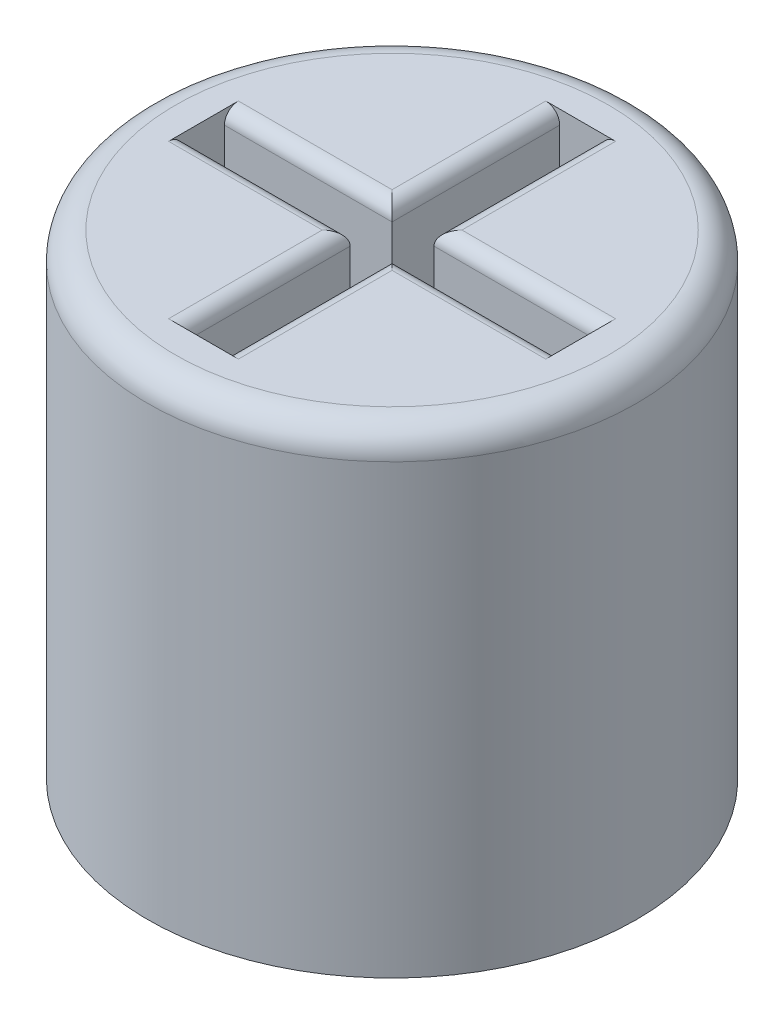
ISO-10303-21;
HEADER;
FILE_DESCRIPTION(('STEP AP214'),'2;1');
FILE_NAME('part.step','',(''),(''),'','','');
FILE_SCHEMA(('AUTOMOTIVE_DESIGN { 1 0 10303 214 1 1 1 1 }'));
ENDSEC;
DATA;
#1=APPLICATION_CONTEXT('core data for automotive mechanical design processes');
#2=APPLICATION_PROTOCOL_DEFINITION('international standard','automotive_design',2000,#1);
#3=PRODUCT_CONTEXT('',#1,'mechanical');
#4=PRODUCT('Part','Part','',(#3));
#5=PRODUCT_RELATED_PRODUCT_CATEGORY('part','',(#4));
#6=PRODUCT_DEFINITION_FORMATION('','',#4);
#7=PRODUCT_DEFINITION_CONTEXT('part definition',#1,'design');
#8=PRODUCT_DEFINITION('design','',#6,#7);
#9=PRODUCT_DEFINITION_SHAPE('','',#8);
#10=(LENGTH_UNIT() NAMED_UNIT(*) SI_UNIT(.MILLI.,.METRE.));
#11=(NAMED_UNIT(*) PLANE_ANGLE_UNIT() SI_UNIT($,.RADIAN.));
#12=(NAMED_UNIT(*) SI_UNIT($,.STERADIAN.) SOLID_ANGLE_UNIT());
#13=UNCERTAINTY_MEASURE_WITH_UNIT(LENGTH_MEASURE(1.E-05),#10,'distance_accuracy_value','');
#14=(GEOMETRIC_REPRESENTATION_CONTEXT(3) GLOBAL_UNCERTAINTY_ASSIGNED_CONTEXT((#13)) GLOBAL_UNIT_ASSIGNED_CONTEXT((#10,
#11,#12)) REPRESENTATION_CONTEXT('',''));
#15=CARTESIAN_POINT('',(0.,0.,0.));
#16=DIRECTION('',(0.,0.,1.));
#17=DIRECTION('',(1.,0.,0.));
#18=AXIS2_PLACEMENT_3D('',#15,#16,#17);
#19=CARTESIAN_POINT('',(-2.575,9.700000149012,-0.250000044703));
#20=DIRECTION('',(-1.,0.,0.));
#21=DIRECTION('',(0.,0.707106781186548,-0.707106781186548));
#22=AXIS2_PLACEMENT_3D('',#19,#20,#21);
#23=CYLINDRICAL_SURFACE('',#22,0.1);
#24=DIRECTION('',(-1.,0.,0.));
#25=VECTOR('',#24,1.);
#26=CARTESIAN_POINT('',(-2.575,9.700000149012,-0.350000044703));
#27=LINE('',#26,#25);
#28=CARTESIAN_POINT('',(-2.65,9.700000149012,-0.350000044703));
#29=VERTEX_POINT('',#28);
#30=CARTESIAN_POINT('',(-3.85,9.700000149012,-0.350000044703));
#31=VERTEX_POINT('',#30);
#32=EDGE_CURVE('E11',#29,#31,#27,.T.);
#33=ORIENTED_EDGE('',*,*,#32,.T.);
#34=CARTESIAN_POINT('',(-3.85,9.700000149012,-0.250000044703));
#35=DIRECTION('',(-1.,0.,0.));
#36=DIRECTION('',(0.,0.707106781186548,-0.707106781186548));
#37=AXIS2_PLACEMENT_3D('',#34,#35,#36);
#38=CIRCLE('',#37,0.1);
#39=CARTESIAN_POINT('',(-3.85,9.800000149012,-0.250000044703));
#40=VERTEX_POINT('',#39);
#41=EDGE_CURVE('E24',#40,#31,#38,.T.);
#42=ORIENTED_EDGE('',*,*,#41,.F.);
#43=DIRECTION('',(1.,0.,0.));
#44=VECTOR('',#43,1.);
#45=CARTESIAN_POINT('',(-2.575,9.800000149012,-0.250000044703));
#46=LINE('',#45,#44);
#47=CARTESIAN_POINT('',(-2.75,9.800000149012,-0.250000044703));
#48=VERTEX_POINT('',#47);
#49=EDGE_CURVE('E317',#40,#48,#46,.T.);
#50=ORIENTED_EDGE('',*,*,#49,.T.);
#51=CARTESIAN_POINT('',(-2.75,9.700000149012,-0.250000044703));
#52=DIRECTION('',(-0.707106781186548,0.,-0.707106781186548));
#53=DIRECTION('',(0.707106781186548,0.,-0.707106781186548));
#54=AXIS2_PLACEMENT_3D('',#51,#52,#53);
#55=ELLIPSE('',#54,0.141421356237,0.1);
#56=EDGE_CURVE('E315',#48,#29,#55,.T.);
#57=ORIENTED_EDGE('',*,*,#56,.T.);
#58=EDGE_LOOP('',(#33,#42,#50,#57));
#59=FACE_BOUND('',#58,.T.);
#60=ADVANCED_FACE('F17',(#59),#23,.T.);
#61=CARTESIAN_POINT('',(-2.75,9.700000149012,0.174999955297));
#62=DIRECTION('',(0.,0.,-1.));
#63=DIRECTION('',(0.707106781186548,0.707106781186548,0.));
#64=AXIS2_PLACEMENT_3D('',#61,#62,#63);
#65=CYLINDRICAL_SURFACE('',#64,0.1);
#66=DIRECTION('',(0.,0.,1.));
#67=VECTOR('',#66,1.);
#68=CARTESIAN_POINT('',(-2.75,9.800000149012,0.174999955297));
#69=LINE('',#68,#67);
#70=CARTESIAN_POINT('',(-2.75,9.800000149012,0.849999955297));
#71=VERTEX_POINT('',#70);
#72=EDGE_CURVE('E313',#48,#71,#69,.T.);
#73=ORIENTED_EDGE('',*,*,#72,.T.);
#74=CARTESIAN_POINT('',(-2.75,9.700000149012,0.849999955297));
#75=DIRECTION('',(0.,0.,1.));
#76=DIRECTION('',(0.707106781186548,0.707106781186548,0.));
#77=AXIS2_PLACEMENT_3D('',#74,#75,#76);
#78=CIRCLE('',#77,0.1);
#79=CARTESIAN_POINT('',(-2.65,9.700000149012,0.849999955297));
#80=VERTEX_POINT('',#79);
#81=EDGE_CURVE('E310',#80,#71,#78,.T.);
#82=ORIENTED_EDGE('',*,*,#81,.F.);
#83=DIRECTION('',(0.,0.,-1.));
#84=VECTOR('',#83,1.);
#85=CARTESIAN_POINT('',(-2.65,9.700000149012,0.174999955297));
#86=LINE('',#85,#84);
#87=EDGE_CURVE('E307',#80,#29,#86,.T.);
#88=ORIENTED_EDGE('',*,*,#87,.T.);
#89=ORIENTED_EDGE('',*,*,#56,.F.);
#90=EDGE_LOOP('',(#73,#82,#88,#89));
#91=FACE_BOUND('',#90,.T.);
#92=ADVANCED_FACE('F343',(#91),#65,.T.);
#93=CARTESIAN_POINT('',(-2.65,9.800000149012,-0.350000044703));
#94=DIRECTION('',(0.,0.,1.));
#95=DIRECTION('',(-1.,0.,0.));
#96=AXIS2_PLACEMENT_3D('',#93,#94,#95);
#97=PLANE('',#96);
#98=ORIENTED_EDGE('',*,*,#32,.F.);
#99=DIRECTION('',(0.,-1.,0.));
#100=VECTOR('',#99,1.);
#101=CARTESIAN_POINT('',(-2.65,9.800000149012,-0.350000044703));
#102=LINE('',#101,#100);
#103=CARTESIAN_POINT('',(-2.65,9.000000149012,-0.350000044703));
#104=VERTEX_POINT('',#103);
#105=EDGE_CURVE('E305',#29,#104,#102,.T.);
#106=ORIENTED_EDGE('',*,*,#105,.T.);
#107=DIRECTION('',(-1.,0.,0.));
#108=VECTOR('',#107,1.);
#109=CARTESIAN_POINT('',(-2.65,9.000000149012,-0.350000044703));
#110=LINE('',#109,#108);
#111=CARTESIAN_POINT('',(-3.85,9.000000149012,-0.350000044703));
#112=VERTEX_POINT('',#111);
#113=EDGE_CURVE('E302',#104,#112,#110,.T.);
#114=ORIENTED_EDGE('',*,*,#113,.T.);
#115=DIRECTION('',(0.,-1.,0.));
#116=VECTOR('',#115,1.);
#117=CARTESIAN_POINT('',(-3.85,9.800000149012,-0.350000044703));
#118=LINE('',#117,#116);
#119=EDGE_CURVE('E300',#31,#112,#118,.T.);
#120=ORIENTED_EDGE('',*,*,#119,.F.);
#121=EDGE_LOOP('',(#98,#106,#114,#120));
#122=FACE_BOUND('',#121,.T.);
#123=ADVANCED_FACE('F322',(#122),#97,.F.);
#124=CARTESIAN_POINT('',(-2.65,9.800000149012,0.849999955297));
#125=DIRECTION('',(-1.,0.,0.));
#126=DIRECTION('',(0.,0.,-1.));
#127=AXIS2_PLACEMENT_3D('',#124,#125,#126);
#128=PLANE('',#127);
#129=ORIENTED_EDGE('',*,*,#87,.F.);
#130=DIRECTION('',(0.,-1.,0.));
#131=VECTOR('',#130,1.);
#132=CARTESIAN_POINT('',(-2.65,9.800000149012,0.849999955297));
#133=LINE('',#132,#131);
#134=CARTESIAN_POINT('',(-2.65,9.000000149012,0.849999955297));
#135=VERTEX_POINT('',#134);
#136=EDGE_CURVE('E297',#80,#135,#133,.T.);
#137=ORIENTED_EDGE('',*,*,#136,.T.);
#138=DIRECTION('',(0.,0.,-1.));
#139=VECTOR('',#138,1.);
#140=CARTESIAN_POINT('',(-2.65,9.000000149012,0.849999955297));
#141=LINE('',#140,#139);
#142=EDGE_CURVE('E294',#135,#104,#141,.T.);
#143=ORIENTED_EDGE('',*,*,#142,.T.);
#144=ORIENTED_EDGE('',*,*,#105,.F.);
#145=EDGE_LOOP('',(#129,#137,#143,#144));
#146=FACE_BOUND('',#145,.T.);
#147=ADVANCED_FACE('F347',(#146),#128,.F.);
#148=CARTESIAN_POINT('',(-2.25,9.700000149012,-0.425000044703));
#149=DIRECTION('',(0.,0.,1.));
#150=DIRECTION('',(-0.707106781186548,0.707106781186548,0.));
#151=AXIS2_PLACEMENT_3D('',#148,#149,#150);
#152=CYLINDRICAL_SURFACE('',#151,0.1);
#153=DIRECTION('',(0.,0.,1.));
#154=VECTOR('',#153,1.);
#155=CARTESIAN_POINT('',(-2.35,9.700000149012,-0.425000044703));
#156=LINE('',#155,#154);
#157=CARTESIAN_POINT('',(-2.35,9.700000149012,-0.350000044703));
#158=VERTEX_POINT('',#157);
#159=CARTESIAN_POINT('',(-2.35,9.700000149012,0.849999955297));
#160=VERTEX_POINT('',#159);
#161=EDGE_CURVE('E292',#158,#160,#156,.T.);
#162=ORIENTED_EDGE('',*,*,#161,.T.);
#163=CARTESIAN_POINT('',(-2.25,9.700000149012,0.849999955297));
#164=DIRECTION('',(0.,0.,1.));
#165=DIRECTION('',(-0.707106781186548,0.707106781186548,0.));
#166=AXIS2_PLACEMENT_3D('',#163,#164,#165);
#167=CIRCLE('',#166,0.1);
#168=CARTESIAN_POINT('',(-2.25,9.800000149012,0.849999955297));
#169=VERTEX_POINT('',#168);
#170=EDGE_CURVE('E289',#169,#160,#167,.T.);
#171=ORIENTED_EDGE('',*,*,#170,.F.);
#172=DIRECTION('',(0.,0.,-1.));
#173=VECTOR('',#172,1.);
#174=CARTESIAN_POINT('',(-2.25,9.800000149012,-0.425000044703));
#175=LINE('',#174,#173);
#176=CARTESIAN_POINT('',(-2.25,9.800000149012,-0.250000044703));
#177=VERTEX_POINT('',#176);
#178=EDGE_CURVE('E287',#169,#177,#175,.T.);
#179=ORIENTED_EDGE('',*,*,#178,.T.);
#180=CARTESIAN_POINT('',(-2.25,9.700000149012,-0.250000044703));
#181=DIRECTION('',(-0.707106781186548,0.,0.707106781186548));
#182=DIRECTION('',(-0.707106781186548,0.,-0.707106781186548));
#183=AXIS2_PLACEMENT_3D('',#180,#181,#182);
#184=ELLIPSE('',#183,0.141421356237,0.1);
#185=EDGE_CURVE('E284',#177,#158,#184,.T.);
#186=ORIENTED_EDGE('',*,*,#185,.T.);
#187=EDGE_LOOP('',(#162,#171,#179,#186));
#188=FACE_BOUND('',#187,.T.);
#189=ADVANCED_FACE('F400',(#188),#152,.T.);
#190=CARTESIAN_POINT('',(-1.825,9.700000149012,-0.250000044703));
#191=DIRECTION('',(-1.,0.,0.));
#192=DIRECTION('',(0.,0.707106781186548,-0.707106781186548));
#193=AXIS2_PLACEMENT_3D('',#190,#191,#192);
#194=CYLINDRICAL_SURFACE('',#193,0.1);
#195=DIRECTION('',(1.,0.,0.));
#196=VECTOR('',#195,1.);
#197=CARTESIAN_POINT('',(-1.825,9.800000149012,-0.250000044703));
#198=LINE('',#197,#196);
#199=CARTESIAN_POINT('',(-1.15,9.800000149012,-0.250000044703));
#200=VERTEX_POINT('',#199);
#201=EDGE_CURVE('E282',#177,#200,#198,.T.);
#202=ORIENTED_EDGE('',*,*,#201,.T.);
#203=CARTESIAN_POINT('',(-1.15,9.700000149012,-0.250000044703));
#204=DIRECTION('',(1.,0.,0.));
#205=DIRECTION('',(0.,0.707106781186548,-0.707106781186548));
#206=AXIS2_PLACEMENT_3D('',#203,#204,#205);
#207=CIRCLE('',#206,0.1);
#208=CARTESIAN_POINT('',(-1.15,9.700000149012,-0.350000044703));
#209=VERTEX_POINT('',#208);
#210=EDGE_CURVE('E279',#209,#200,#207,.T.);
#211=ORIENTED_EDGE('',*,*,#210,.F.);
#212=DIRECTION('',(-1.,0.,0.));
#213=VECTOR('',#212,1.);
#214=CARTESIAN_POINT('',(-1.825,9.700000149012,-0.350000044703));
#215=LINE('',#214,#213);
#216=EDGE_CURVE('E276',#209,#158,#215,.T.);
#217=ORIENTED_EDGE('',*,*,#216,.T.);
#218=ORIENTED_EDGE('',*,*,#185,.F.);
#219=EDGE_LOOP('',(#202,#211,#217,#218));
#220=FACE_BOUND('',#219,.T.);
#221=ADVANCED_FACE('F403',(#220),#194,.T.);
#222=CARTESIAN_POINT('',(-2.35,9.800000149012,-0.350000044703));
#223=DIRECTION('',(1.,0.,0.));
#224=DIRECTION('',(0.,0.,1.));
#225=AXIS2_PLACEMENT_3D('',#222,#223,#224);
#226=PLANE('',#225);
#227=ORIENTED_EDGE('',*,*,#161,.F.);
#228=DIRECTION('',(0.,-1.,0.));
#229=VECTOR('',#228,1.);
#230=CARTESIAN_POINT('',(-2.35,9.800000149012,-0.350000044703));
#231=LINE('',#230,#229);
#232=CARTESIAN_POINT('',(-2.35,9.000000149012,-0.350000044703));
#233=VERTEX_POINT('',#232);
#234=EDGE_CURVE('E273',#158,#233,#231,.T.);
#235=ORIENTED_EDGE('',*,*,#234,.T.);
#236=DIRECTION('',(0.,0.,1.));
#237=VECTOR('',#236,1.);
#238=CARTESIAN_POINT('',(-2.35,9.000000149012,-0.350000044703));
#239=LINE('',#238,#237);
#240=CARTESIAN_POINT('',(-2.35,9.000000149012,0.849999955297));
#241=VERTEX_POINT('',#240);
#242=EDGE_CURVE('E270',#233,#241,#239,.T.);
#243=ORIENTED_EDGE('',*,*,#242,.T.);
#244=DIRECTION('',(0.,-1.,0.));
#245=VECTOR('',#244,1.);
#246=CARTESIAN_POINT('',(-2.35,9.800000149012,0.849999955297));
#247=LINE('',#246,#245);
#248=EDGE_CURVE('E268',#160,#241,#247,.T.);
#249=ORIENTED_EDGE('',*,*,#248,.F.);
#250=EDGE_LOOP('',(#227,#235,#243,#249));
#251=FACE_BOUND('',#250,.T.);
#252=ADVANCED_FACE('F354',(#251),#226,.F.);
#253=CARTESIAN_POINT('',(-1.15,9.800000149012,-0.350000044703));
#254=DIRECTION('',(0.,0.,1.));
#255=DIRECTION('',(-1.,0.,0.));
#256=AXIS2_PLACEMENT_3D('',#253,#254,#255);
#257=PLANE('',#256);
#258=ORIENTED_EDGE('',*,*,#216,.F.);
#259=DIRECTION('',(0.,-1.,0.));
#260=VECTOR('',#259,1.);
#261=CARTESIAN_POINT('',(-1.15,9.800000149012,-0.350000044703));
#262=LINE('',#261,#260);
#263=CARTESIAN_POINT('',(-1.15,9.000000149012,-0.350000044703));
#264=VERTEX_POINT('',#263);
#265=EDGE_CURVE('E265',#209,#264,#262,.T.);
#266=ORIENTED_EDGE('',*,*,#265,.T.);
#267=DIRECTION('',(-1.,0.,0.));
#268=VECTOR('',#267,1.);
#269=CARTESIAN_POINT('',(-1.15,9.000000149012,-0.350000044703));
#270=LINE('',#269,#268);
#271=EDGE_CURVE('E262',#264,#233,#270,.T.);
#272=ORIENTED_EDGE('',*,*,#271,.T.);
#273=ORIENTED_EDGE('',*,*,#234,.F.);
#274=EDGE_LOOP('',(#258,#266,#272,#273));
#275=FACE_BOUND('',#274,.T.);
#276=ADVANCED_FACE('F358',(#275),#257,.F.);
#277=CARTESIAN_POINT('',(-2.425,9.700000149012,-0.750000044703));
#278=DIRECTION('',(1.,0.,0.));
#279=DIRECTION('',(0.,0.707106781186548,0.707106781186548));
#280=AXIS2_PLACEMENT_3D('',#277,#278,#279);
#281=CYLINDRICAL_SURFACE('',#280,0.1);
#282=DIRECTION('',(1.,0.,0.));
#283=VECTOR('',#282,1.);
#284=CARTESIAN_POINT('',(-2.425,9.700000149012,-0.650000044703));
#285=LINE('',#284,#283);
#286=CARTESIAN_POINT('',(-2.35,9.700000149012,-0.650000044703));
#287=VERTEX_POINT('',#286);
#288=CARTESIAN_POINT('',(-1.15,9.700000149012,-0.650000044703));
#289=VERTEX_POINT('',#288);
#290=EDGE_CURVE('E260',#287,#289,#285,.T.);
#291=ORIENTED_EDGE('',*,*,#290,.T.);
#292=CARTESIAN_POINT('',(-1.15,9.700000149012,-0.750000044703));
#293=DIRECTION('',(1.,0.,0.));
#294=DIRECTION('',(0.,0.707106781186548,0.707106781186548));
#295=AXIS2_PLACEMENT_3D('',#292,#293,#294);
#296=CIRCLE('',#295,0.1);
#297=CARTESIAN_POINT('',(-1.15,9.800000149012,-0.750000044703));
#298=VERTEX_POINT('',#297);
#299=EDGE_CURVE('E257',#298,#289,#296,.T.);
#300=ORIENTED_EDGE('',*,*,#299,.F.);
#301=DIRECTION('',(-1.,0.,0.));
#302=VECTOR('',#301,1.);
#303=CARTESIAN_POINT('',(-2.425,9.800000149012,-0.750000044703));
#304=LINE('',#303,#302);
#305=CARTESIAN_POINT('',(-2.25,9.800000149012,-0.750000044703));
#306=VERTEX_POINT('',#305);
#307=EDGE_CURVE('E255',#298,#306,#304,.T.);
#308=ORIENTED_EDGE('',*,*,#307,.T.);
#309=CARTESIAN_POINT('',(-2.25,9.700000149012,-0.750000044703));
#310=DIRECTION('',(0.707106781186548,0.,0.707106781186548));
#311=DIRECTION('',(-0.707106781186548,0.,0.707106781186548));
#312=AXIS2_PLACEMENT_3D('',#309,#310,#311);
#313=ELLIPSE('',#312,0.141421356237,0.1);
#314=EDGE_CURVE('E252',#306,#287,#313,.T.);
#315=ORIENTED_EDGE('',*,*,#314,.T.);
#316=EDGE_LOOP('',(#291,#300,#308,#315));
#317=FACE_BOUND('',#316,.T.);
#318=ADVANCED_FACE('F412',(#317),#281,.T.);
#319=CARTESIAN_POINT('',(-2.25,9.700000149012,-1.175000044703));
#320=DIRECTION('',(0.,0.,1.));
#321=DIRECTION('',(-0.707106781186548,0.707106781186548,0.));
#322=AXIS2_PLACEMENT_3D('',#319,#320,#321);
#323=CYLINDRICAL_SURFACE('',#322,0.1);
#324=DIRECTION('',(0.,0.,-1.));
#325=VECTOR('',#324,1.);
#326=CARTESIAN_POINT('',(-2.25,9.800000149012,-1.175000044703));
#327=LINE('',#326,#325);
#328=CARTESIAN_POINT('',(-2.25,9.800000149012,-1.850000044703));
#329=VERTEX_POINT('',#328);
#330=EDGE_CURVE('E250',#306,#329,#327,.T.);
#331=ORIENTED_EDGE('',*,*,#330,.T.);
#332=CARTESIAN_POINT('',(-2.25,9.700000149012,-1.850000044703));
#333=DIRECTION('',(0.,0.,-1.));
#334=DIRECTION('',(-0.707106781186548,0.707106781186548,0.));
#335=AXIS2_PLACEMENT_3D('',#332,#333,#334);
#336=CIRCLE('',#335,0.1);
#337=CARTESIAN_POINT('',(-2.35,9.700000149012,-1.850000044703));
#338=VERTEX_POINT('',#337);
#339=EDGE_CURVE('E247',#338,#329,#336,.T.);
#340=ORIENTED_EDGE('',*,*,#339,.F.);
#341=DIRECTION('',(0.,0.,1.));
#342=VECTOR('',#341,1.);
#343=CARTESIAN_POINT('',(-2.35,9.700000149012,-1.175000044703));
#344=LINE('',#343,#342);
#345=EDGE_CURVE('E244',#338,#287,#344,.T.);
#346=ORIENTED_EDGE('',*,*,#345,.T.);
#347=ORIENTED_EDGE('',*,*,#314,.F.);
#348=EDGE_LOOP('',(#331,#340,#346,#347));
#349=FACE_BOUND('',#348,.T.);
#350=ADVANCED_FACE('F415',(#349),#323,.T.);
#351=CARTESIAN_POINT('',(-2.35,9.800000149012,-0.650000044703));
#352=DIRECTION('',(0.,0.,-1.));
#353=DIRECTION('',(1.,0.,0.));
#354=AXIS2_PLACEMENT_3D('',#351,#352,#353);
#355=PLANE('',#354);
#356=ORIENTED_EDGE('',*,*,#290,.F.);
#357=DIRECTION('',(0.,-1.,0.));
#358=VECTOR('',#357,1.);
#359=CARTESIAN_POINT('',(-2.35,9.800000149012,-0.650000044703));
#360=LINE('',#359,#358);
#361=CARTESIAN_POINT('',(-2.35,9.000000149012,-0.650000044703));
#362=VERTEX_POINT('',#361);
#363=EDGE_CURVE('E241',#287,#362,#360,.T.);
#364=ORIENTED_EDGE('',*,*,#363,.T.);
#365=DIRECTION('',(1.,0.,0.));
#366=VECTOR('',#365,1.);
#367=CARTESIAN_POINT('',(-2.35,9.000000149012,-0.650000044703));
#368=LINE('',#367,#366);
#369=CARTESIAN_POINT('',(-1.15,9.000000149012,-0.650000044703));
#370=VERTEX_POINT('',#369);
#371=EDGE_CURVE('E238',#362,#370,#368,.T.);
#372=ORIENTED_EDGE('',*,*,#371,.T.);
#373=DIRECTION('',(0.,-1.,0.));
#374=VECTOR('',#373,1.);
#375=CARTESIAN_POINT('',(-1.15,9.800000149012,-0.650000044703));
#376=LINE('',#375,#374);
#377=EDGE_CURVE('E236',#289,#370,#376,.T.);
#378=ORIENTED_EDGE('',*,*,#377,.F.);
#379=EDGE_LOOP('',(#356,#364,#372,#378));
#380=FACE_BOUND('',#379,.T.);
#381=ADVANCED_FACE('F366',(#380),#355,.F.);
#382=CARTESIAN_POINT('',(-2.35,9.800000149012,-1.850000044703));
#383=DIRECTION('',(1.,0.,0.));
#384=DIRECTION('',(0.,0.,1.));
#385=AXIS2_PLACEMENT_3D('',#382,#383,#384);
#386=PLANE('',#385);
#387=ORIENTED_EDGE('',*,*,#345,.F.);
#388=DIRECTION('',(0.,-1.,0.));
#389=VECTOR('',#388,1.);
#390=CARTESIAN_POINT('',(-2.35,9.800000149012,-1.850000044703));
#391=LINE('',#390,#389);
#392=CARTESIAN_POINT('',(-2.35,9.000000149012,-1.850000044703));
#393=VERTEX_POINT('',#392);
#394=EDGE_CURVE('E233',#338,#393,#391,.T.);
#395=ORIENTED_EDGE('',*,*,#394,.T.);
#396=DIRECTION('',(0.,0.,1.));
#397=VECTOR('',#396,1.);
#398=CARTESIAN_POINT('',(-2.35,9.000000149012,-1.850000044703));
#399=LINE('',#398,#397);
#400=EDGE_CURVE('E230',#393,#362,#399,.T.);
#401=ORIENTED_EDGE('',*,*,#400,.T.);
#402=ORIENTED_EDGE('',*,*,#363,.F.);
#403=EDGE_LOOP('',(#387,#395,#401,#402));
#404=FACE_BOUND('',#403,.T.);
#405=ADVANCED_FACE('F370',(#404),#386,.F.);
#406=CARTESIAN_POINT('',(-2.75,9.700000149012,-0.575000044703));
#407=DIRECTION('',(0.,0.,-1.));
#408=DIRECTION('',(0.707106781186548,0.707106781186548,0.));
#409=AXIS2_PLACEMENT_3D('',#406,#407,#408);
#410=CYLINDRICAL_SURFACE('',#409,0.1);
#411=DIRECTION('',(0.,0.,-1.));
#412=VECTOR('',#411,1.);
#413=CARTESIAN_POINT('',(-2.65,9.700000149012,-0.575000044703));
#414=LINE('',#413,#412);
#415=CARTESIAN_POINT('',(-2.65,9.700000149012,-0.650000044703));
#416=VERTEX_POINT('',#415);
#417=CARTESIAN_POINT('',(-2.65,9.700000149012,-1.850000044703));
#418=VERTEX_POINT('',#417);
#419=EDGE_CURVE('E228',#416,#418,#414,.T.);
#420=ORIENTED_EDGE('',*,*,#419,.T.);
#421=CARTESIAN_POINT('',(-2.75,9.700000149012,-1.850000044703));
#422=DIRECTION('',(0.,0.,-1.));
#423=DIRECTION('',(0.707106781186548,0.707106781186548,0.));
#424=AXIS2_PLACEMENT_3D('',#421,#422,#423);
#425=CIRCLE('',#424,0.1);
#426=CARTESIAN_POINT('',(-2.75,9.800000149012,-1.850000044703));
#427=VERTEX_POINT('',#426);
#428=EDGE_CURVE('E225',#427,#418,#425,.T.);
#429=ORIENTED_EDGE('',*,*,#428,.F.);
#430=DIRECTION('',(0.,0.,1.));
#431=VECTOR('',#430,1.);
#432=CARTESIAN_POINT('',(-2.75,9.800000149012,-0.575000044703));
#433=LINE('',#432,#431);
#434=CARTESIAN_POINT('',(-2.75,9.800000149012,-0.750000044703));
#435=VERTEX_POINT('',#434);
#436=EDGE_CURVE('E223',#427,#435,#433,.T.);
#437=ORIENTED_EDGE('',*,*,#436,.T.);
#438=CARTESIAN_POINT('',(-2.75,9.700000149012,-0.750000044703));
#439=DIRECTION('',(0.707106781186548,0.,-0.707106781186548));
#440=DIRECTION('',(0.707106781186548,0.,0.707106781186548));
#441=AXIS2_PLACEMENT_3D('',#438,#439,#440);
#442=ELLIPSE('',#441,0.141421356237,0.1);
#443=EDGE_CURVE('E220',#435,#416,#442,.T.);
#444=ORIENTED_EDGE('',*,*,#443,.T.);
#445=EDGE_LOOP('',(#420,#429,#437,#444));
#446=FACE_BOUND('',#445,.T.);
#447=ADVANCED_FACE('F379',(#446),#410,.T.);
#448=CARTESIAN_POINT('',(-3.175,9.700000149012,-0.750000044703));
#449=DIRECTION('',(1.,0.,0.));
#450=DIRECTION('',(0.,0.707106781186548,0.707106781186548));
#451=AXIS2_PLACEMENT_3D('',#448,#449,#450);
#452=CYLINDRICAL_SURFACE('',#451,0.1);
#453=DIRECTION('',(-1.,0.,0.));
#454=VECTOR('',#453,1.);
#455=CARTESIAN_POINT('',(-3.175,9.800000149012,-0.750000044703));
#456=LINE('',#455,#454);
#457=CARTESIAN_POINT('',(-3.85,9.800000149012,-0.750000044703));
#458=VERTEX_POINT('',#457);
#459=EDGE_CURVE('E218',#435,#458,#456,.T.);
#460=ORIENTED_EDGE('',*,*,#459,.T.);
#461=CARTESIAN_POINT('',(-3.85,9.700000149012,-0.750000044703));
#462=DIRECTION('',(-1.,0.,0.));
#463=DIRECTION('',(0.,0.707106781186548,0.707106781186548));
#464=AXIS2_PLACEMENT_3D('',#461,#462,#463);
#465=CIRCLE('',#464,0.1);
#466=CARTESIAN_POINT('',(-3.85,9.700000149012,-0.650000044703));
#467=VERTEX_POINT('',#466);
#468=EDGE_CURVE('E215',#467,#458,#465,.T.);
#469=ORIENTED_EDGE('',*,*,#468,.F.);
#470=DIRECTION('',(1.,0.,0.));
#471=VECTOR('',#470,1.);
#472=CARTESIAN_POINT('',(-3.175,9.700000149012,-0.650000044703));
#473=LINE('',#472,#471);
#474=EDGE_CURVE('E212',#467,#416,#473,.T.);
#475=ORIENTED_EDGE('',*,*,#474,.T.);
#476=ORIENTED_EDGE('',*,*,#443,.F.);
#477=EDGE_LOOP('',(#460,#469,#475,#476));
#478=FACE_BOUND('',#477,.T.);
#479=ADVANCED_FACE('F334',(#478),#452,.T.);
#480=CARTESIAN_POINT('',(-2.65,9.800000149012,-0.650000044703));
#481=DIRECTION('',(-1.,0.,0.));
#482=DIRECTION('',(0.,0.,-1.));
#483=AXIS2_PLACEMENT_3D('',#480,#481,#482);
#484=PLANE('',#483);
#485=ORIENTED_EDGE('',*,*,#419,.F.);
#486=DIRECTION('',(0.,-1.,0.));
#487=VECTOR('',#486,1.);
#488=CARTESIAN_POINT('',(-2.65,9.800000149012,-0.650000044703));
#489=LINE('',#488,#487);
#490=CARTESIAN_POINT('',(-2.65,9.000000149012,-0.650000044703));
#491=VERTEX_POINT('',#490);
#492=EDGE_CURVE('E209',#416,#491,#489,.T.);
#493=ORIENTED_EDGE('',*,*,#492,.T.);
#494=DIRECTION('',(0.,0.,-1.));
#495=VECTOR('',#494,1.);
#496=CARTESIAN_POINT('',(-2.65,9.000000149012,-0.650000044703));
#497=LINE('',#496,#495);
#498=CARTESIAN_POINT('',(-2.65,9.000000149012,-1.850000044703));
#499=VERTEX_POINT('',#498);
#500=EDGE_CURVE('E206',#491,#499,#497,.T.);
#501=ORIENTED_EDGE('',*,*,#500,.T.);
#502=DIRECTION('',(0.,-1.,0.));
#503=VECTOR('',#502,1.);
#504=CARTESIAN_POINT('',(-2.65,9.800000149012,-1.850000044703));
#505=LINE('',#504,#503);
#506=EDGE_CURVE('E204',#418,#499,#505,.T.);
#507=ORIENTED_EDGE('',*,*,#506,.F.);
#508=EDGE_LOOP('',(#485,#493,#501,#507));
#509=FACE_BOUND('',#508,.T.);
#510=ADVANCED_FACE('F377',(#509),#484,.F.);
#511=CARTESIAN_POINT('',(-3.85,9.800000149012,-0.650000044703));
#512=DIRECTION('',(0.,0.,-1.));
#513=DIRECTION('',(1.,0.,0.));
#514=AXIS2_PLACEMENT_3D('',#511,#512,#513);
#515=PLANE('',#514);
#516=ORIENTED_EDGE('',*,*,#474,.F.);
#517=DIRECTION('',(0.,-1.,0.));
#518=VECTOR('',#517,1.);
#519=CARTESIAN_POINT('',(-3.85,9.800000149012,-0.650000044703));
#520=LINE('',#519,#518);
#521=CARTESIAN_POINT('',(-3.85,9.000000149012,-0.650000044703));
#522=VERTEX_POINT('',#521);
#523=EDGE_CURVE('E201',#467,#522,#520,.T.);
#524=ORIENTED_EDGE('',*,*,#523,.T.);
#525=DIRECTION('',(1.,0.,0.));
#526=VECTOR('',#525,1.);
#527=CARTESIAN_POINT('',(-3.85,9.000000149012,-0.650000044703));
#528=LINE('',#527,#526);
#529=EDGE_CURVE('E198',#522,#491,#528,.T.);
#530=ORIENTED_EDGE('',*,*,#529,.T.);
#531=ORIENTED_EDGE('',*,*,#492,.F.);
#532=EDGE_LOOP('',(#516,#524,#530,#531));
#533=FACE_BOUND('',#532,.T.);
#534=ADVANCED_FACE('F330',(#533),#515,.F.);
#535=CARTESIAN_POINT('',(-3.85,9.800000149012,-0.350000044703));
#536=DIRECTION('',(-1.,0.,0.));
#537=DIRECTION('',(0.,0.,-1.));
#538=AXIS2_PLACEMENT_3D('',#535,#536,#537);
#539=PLANE('',#538);
#540=DIRECTION('',(0.,0.,-1.));
#541=VECTOR('',#540,1.);
#542=CARTESIAN_POINT('',(-3.85,9.800000149012,-0.425000044703));
#543=LINE('',#542,#541);
#544=EDGE_CURVE('E195',#40,#458,#543,.T.);
#545=ORIENTED_EDGE('',*,*,#544,.F.);
#546=ORIENTED_EDGE('',*,*,#41,.T.);
#547=ORIENTED_EDGE('',*,*,#119,.T.);
#548=DIRECTION('',(0.,0.,-1.));
#549=VECTOR('',#548,1.);
#550=CARTESIAN_POINT('',(-3.85,9.000000149012,-0.350000044703));
#551=LINE('',#550,#549);
#552=EDGE_CURVE('E192',#112,#522,#551,.T.);
#553=ORIENTED_EDGE('',*,*,#552,.T.);
#554=ORIENTED_EDGE('',*,*,#523,.F.);
#555=ORIENTED_EDGE('',*,*,#468,.T.);
#556=EDGE_LOOP('',(#545,#546,#547,#553,#554,#555));
#557=FACE_BOUND('',#556,.T.);
#558=ADVANCED_FACE('F320',(#557),#539,.F.);
#559=CARTESIAN_POINT('',(-2.35,9.800000149012,0.849999955297));
#560=DIRECTION('',(0.,0.,1.));
#561=DIRECTION('',(-1.,0.,0.));
#562=AXIS2_PLACEMENT_3D('',#559,#560,#561);
#563=PLANE('',#562);
#564=DIRECTION('',(-1.,0.,0.));
#565=VECTOR('',#564,1.);
#566=CARTESIAN_POINT('',(-2.425,9.800000149012,0.849999955297));
#567=LINE('',#566,#565);
#568=EDGE_CURVE('E189',#169,#71,#567,.T.);
#569=ORIENTED_EDGE('',*,*,#568,.F.);
#570=ORIENTED_EDGE('',*,*,#170,.T.);
#571=ORIENTED_EDGE('',*,*,#248,.T.);
#572=DIRECTION('',(-1.,0.,0.));
#573=VECTOR('',#572,1.);
#574=CARTESIAN_POINT('',(-2.35,9.000000149012,0.849999955297));
#575=LINE('',#574,#573);
#576=EDGE_CURVE('E186',#241,#135,#575,.T.);
#577=ORIENTED_EDGE('',*,*,#576,.T.);
#578=ORIENTED_EDGE('',*,*,#136,.F.);
#579=ORIENTED_EDGE('',*,*,#81,.T.);
#580=EDGE_LOOP('',(#569,#570,#571,#577,#578,#579));
#581=FACE_BOUND('',#580,.T.);
#582=ADVANCED_FACE('F351',(#581),#563,.F.);
#583=CARTESIAN_POINT('',(-1.15,9.800000149012,-0.650000044703));
#584=DIRECTION('',(1.,0.,0.));
#585=DIRECTION('',(0.,0.,1.));
#586=AXIS2_PLACEMENT_3D('',#583,#584,#585);
#587=PLANE('',#586);
#588=DIRECTION('',(0.,0.,1.));
#589=VECTOR('',#588,1.);
#590=CARTESIAN_POINT('',(-1.15,9.800000149012,-0.575000044703));
#591=LINE('',#590,#589);
#592=EDGE_CURVE('E183',#298,#200,#591,.T.);
#593=ORIENTED_EDGE('',*,*,#592,.F.);
#594=ORIENTED_EDGE('',*,*,#299,.T.);
#595=ORIENTED_EDGE('',*,*,#377,.T.);
#596=DIRECTION('',(0.,0.,1.));
#597=VECTOR('',#596,1.);
#598=CARTESIAN_POINT('',(-1.15,9.000000149012,-0.650000044703));
#599=LINE('',#598,#597);
#600=EDGE_CURVE('E180',#370,#264,#599,.T.);
#601=ORIENTED_EDGE('',*,*,#600,.T.);
#602=ORIENTED_EDGE('',*,*,#265,.F.);
#603=ORIENTED_EDGE('',*,*,#210,.T.);
#604=EDGE_LOOP('',(#593,#594,#595,#601,#602,#603));
#605=FACE_BOUND('',#604,.T.);
#606=ADVANCED_FACE('F363',(#605),#587,.F.);
#607=CARTESIAN_POINT('',(-2.65,9.800000149012,-1.850000044703));
#608=DIRECTION('',(0.,0.,-1.));
#609=DIRECTION('',(1.,0.,0.));
#610=AXIS2_PLACEMENT_3D('',#607,#608,#609);
#611=PLANE('',#610);
#612=DIRECTION('',(1.,0.,0.));
#613=VECTOR('',#612,1.);
#614=CARTESIAN_POINT('',(-2.575,9.800000149012,-1.850000044703));
#615=LINE('',#614,#613);
#616=EDGE_CURVE('E177',#427,#329,#615,.T.);
#617=ORIENTED_EDGE('',*,*,#616,.F.);
#618=ORIENTED_EDGE('',*,*,#428,.T.);
#619=ORIENTED_EDGE('',*,*,#506,.T.);
#620=DIRECTION('',(1.,0.,0.));
#621=VECTOR('',#620,1.);
#622=CARTESIAN_POINT('',(-2.65,9.000000149012,-1.850000044703));
#623=LINE('',#622,#621);
#624=EDGE_CURVE('E174',#499,#393,#623,.T.);
#625=ORIENTED_EDGE('',*,*,#624,.T.);
#626=ORIENTED_EDGE('',*,*,#394,.F.);
#627=ORIENTED_EDGE('',*,*,#339,.T.);
#628=EDGE_LOOP('',(#617,#618,#619,#625,#626,#627));
#629=FACE_BOUND('',#628,.T.);
#630=ADVANCED_FACE('F374',(#629),#611,.F.);
#631=CARTESIAN_POINT('',(-2.5,9.000000149012,-0.500000044703));
#632=DIRECTION('',(0.,-1.,0.));
#633=DIRECTION('',(0.,0.,-1.));
#634=AXIS2_PLACEMENT_3D('',#631,#632,#633);
#635=PLANE('',#634);
#636=ORIENTED_EDGE('',*,*,#529,.F.);
#637=ORIENTED_EDGE('',*,*,#552,.F.);
#638=ORIENTED_EDGE('',*,*,#113,.F.);
#639=ORIENTED_EDGE('',*,*,#142,.F.);
#640=ORIENTED_EDGE('',*,*,#576,.F.);
#641=ORIENTED_EDGE('',*,*,#242,.F.);
#642=ORIENTED_EDGE('',*,*,#271,.F.);
#643=ORIENTED_EDGE('',*,*,#600,.F.);
#644=ORIENTED_EDGE('',*,*,#371,.F.);
#645=ORIENTED_EDGE('',*,*,#400,.F.);
#646=ORIENTED_EDGE('',*,*,#624,.F.);
#647=ORIENTED_EDGE('',*,*,#500,.F.);
#648=EDGE_LOOP('',(#636,#637,#638,#639,#640,#641,#642,#643,#644,#645,#646,#647));
#649=FACE_BOUND('',#648,.T.);
#650=ADVANCED_FACE('F326',(#649),#635,.F.);
#651=CARTESIAN_POINT('',(-2.5,9.600000149012,-0.500000044703));
#652=DIRECTION('',(0.,1.,0.));
#653=DIRECTION('',(0.,0.,1.));
#654=AXIS2_PLACEMENT_3D('',#651,#652,#653);
#655=TOROIDAL_SURFACE('',#654,1.55,0.2);
#656=CARTESIAN_POINT('',(-2.5,9.800000149012,-0.500000044703));
#657=DIRECTION('',(0.,-1.,0.));
#658=DIRECTION('',(-1.,0.,0.));
#659=AXIS2_PLACEMENT_3D('',#656,#657,#658);
#660=CIRCLE('',#659,1.55);
#661=CARTESIAN_POINT('',(-0.95,9.800000149012,-0.500000044703));
#662=VERTEX_POINT('',#661);
#663=CARTESIAN_POINT('',(-2.5,9.800000149012,-2.050000044703));
#664=VERTEX_POINT('',#663);
#665=EDGE_CURVE('E172',#662,#664,#660,.T.);
#666=ORIENTED_EDGE('',*,*,#665,.T.);
#667=CARTESIAN_POINT('',(-2.5,9.600000149012,-2.050000044703));
#668=DIRECTION('',(-1.,0.,0.));
#669=DIRECTION('',(0.,0.,-1.));
#670=AXIS2_PLACEMENT_3D('',#667,#668,#669);
#671=CIRCLE('',#670,0.2);
#672=CARTESIAN_POINT('',(-2.5,9.600000149012,-2.250000044703));
#673=VERTEX_POINT('',#672);
#674=EDGE_CURVE('E170',#664,#673,#671,.T.);
#675=ORIENTED_EDGE('',*,*,#674,.T.);
#676=CARTESIAN_POINT('',(-2.5,9.600000149012,-0.500000044703));
#677=DIRECTION('',(0.,1.,0.));
#678=DIRECTION('',(-1.,0.,0.));
#679=AXIS2_PLACEMENT_3D('',#676,#677,#678);
#680=CIRCLE('',#679,1.75);
#681=CARTESIAN_POINT('',(-0.75,9.600000149012,-0.500000044703));
#682=VERTEX_POINT('',#681);
#683=EDGE_CURVE('E168',#673,#682,#680,.T.);
#684=ORIENTED_EDGE('',*,*,#683,.T.);
#685=CARTESIAN_POINT('',(-2.5,9.600000149012,-0.500000044703));
#686=DIRECTION('',(0.,1.,0.));
#687=DIRECTION('',(-1.,0.,0.));
#688=AXIS2_PLACEMENT_3D('',#685,#686,#687);
#689=CIRCLE('',#688,1.75);
#690=EDGE_CURVE('E160',#682,#673,#689,.T.);
#691=ORIENTED_EDGE('',*,*,#690,.T.);
#692=ORIENTED_EDGE('',*,*,#674,.F.);
#693=CARTESIAN_POINT('',(-2.5,9.800000149012,-0.500000044703));
#694=DIRECTION('',(0.,-1.,0.));
#695=DIRECTION('',(-1.,0.,0.));
#696=AXIS2_PLACEMENT_3D('',#693,#694,#695);
#697=CIRCLE('',#696,1.55);
#698=EDGE_CURVE('E161',#664,#662,#697,.T.);
#699=ORIENTED_EDGE('',*,*,#698,.T.);
#700=EDGE_LOOP('',(#666,#675,#684,#691,#692,#699));
#701=FACE_BOUND('',#700,.T.);
#702=ADVANCED_FACE('F501',(#701),#655,.T.);
#703=CARTESIAN_POINT('',(-2.5,6.400000149012,-0.500000044703));
#704=DIRECTION('',(0.,1.,0.));
#705=DIRECTION('',(-1.,0.,0.));
#706=AXIS2_PLACEMENT_3D('',#703,#704,#705);
#707=CYLINDRICAL_SURFACE('',#706,1.75);
#708=ORIENTED_EDGE('',*,*,#690,.F.);
#709=DIRECTION('',(0.,-1.,0.));
#710=VECTOR('',#709,1.);
#711=CARTESIAN_POINT('',(-0.75,6.400000149012,-0.500000044703));
#712=LINE('',#711,#710);
#713=CARTESIAN_POINT('',(-0.75,6.400000149012,-0.500000044703));
#714=VERTEX_POINT('',#713);
#715=EDGE_CURVE('E154',#682,#714,#712,.T.);
#716=ORIENTED_EDGE('',*,*,#715,.T.);
#717=CARTESIAN_POINT('',(-2.5,6.400000149012,-0.500000044703));
#718=DIRECTION('',(0.,1.,0.));
#719=DIRECTION('',(-1.,0.,0.));
#720=AXIS2_PLACEMENT_3D('',#717,#718,#719);
#721=CIRCLE('',#720,1.75);
#722=EDGE_CURVE('E157',#714,#714,#721,.T.);
#723=ORIENTED_EDGE('',*,*,#722,.T.);
#724=ORIENTED_EDGE('',*,*,#715,.F.);
#725=ORIENTED_EDGE('',*,*,#683,.F.);
#726=EDGE_LOOP('',(#708,#716,#723,#724,#725));
#727=FACE_BOUND('',#726,.T.);
#728=ADVANCED_FACE('F155',(#727),#707,.T.);
#729=CARTESIAN_POINT('',(-2.5,9.800000149012,-0.500000044703));
#730=DIRECTION('',(0.,1.,0.));
#731=DIRECTION('',(-1.,0.,0.));
#732=AXIS2_PLACEMENT_3D('',#729,#730,#731);
#733=PLANE('',#732);
#734=ORIENTED_EDGE('',*,*,#665,.F.);
#735=ORIENTED_EDGE('',*,*,#698,.F.);
#736=EDGE_LOOP('',(#734,#735));
#737=FACE_BOUND('',#736,.T.);
#738=ORIENTED_EDGE('',*,*,#544,.T.);
#739=ORIENTED_EDGE('',*,*,#459,.F.);
#740=ORIENTED_EDGE('',*,*,#436,.F.);
#741=ORIENTED_EDGE('',*,*,#616,.T.);
#742=ORIENTED_EDGE('',*,*,#330,.F.);
#743=ORIENTED_EDGE('',*,*,#307,.F.);
#744=ORIENTED_EDGE('',*,*,#592,.T.);
#745=ORIENTED_EDGE('',*,*,#201,.F.);
#746=ORIENTED_EDGE('',*,*,#178,.F.);
#747=ORIENTED_EDGE('',*,*,#568,.T.);
#748=ORIENTED_EDGE('',*,*,#72,.F.);
#749=ORIENTED_EDGE('',*,*,#49,.F.);
#750=EDGE_LOOP('',(#738,#739,#740,#741,#742,#743,#744,#745,#746,#747,#748,#749));
#751=FACE_BOUND('',#750,.T.);
#752=ADVANCED_FACE('F338',(#737,#751),#733,.T.);
#753=CARTESIAN_POINT('',(-2.5,6.400000149012,-0.500000044703));
#754=DIRECTION('',(0.,1.,0.));
#755=DIRECTION('',(-1.,0.,0.));
#756=AXIS2_PLACEMENT_3D('',#753,#754,#755);
#757=PLANE('',#756);
#758=ORIENTED_EDGE('',*,*,#722,.F.);
#759=EDGE_LOOP('',(#758));
#760=FACE_BOUND('',#759,.T.);
#761=ADVANCED_FACE('F527',(#760),#757,.F.);
#762=CLOSED_SHELL('',(#60,#92,#123,#147,#189,#221,#252,#276,#318,#350,#381,#405,#447,#479,#510,
#534,#558,#582,#606,#630,#650,#702,#728,#752,#761));
#763=MANIFOLD_SOLID_BREP('B1',#762);
#764=ADVANCED_BREP_SHAPE_REPRESENTATION('',(#18,#763),#14);
#765=SHAPE_DEFINITION_REPRESENTATION(#9,#764);
ENDSEC;
END-ISO-10303-21;
